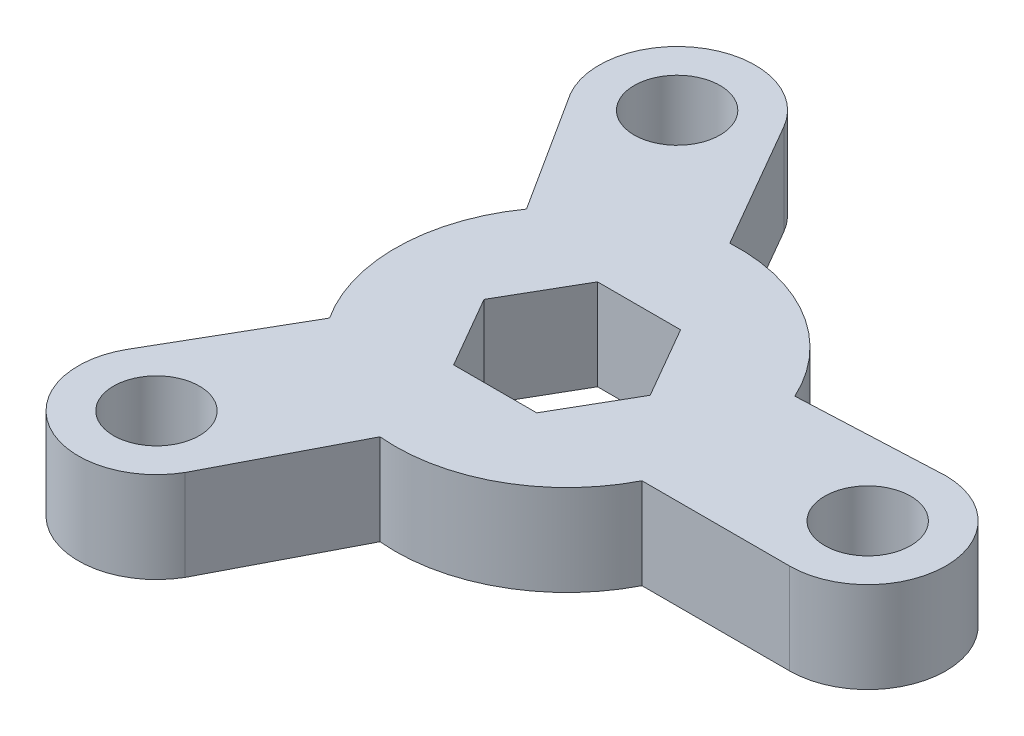
ISO-10303-21;
HEADER;
FILE_DESCRIPTION(('STEP AP214'),'2;1');
FILE_NAME('part.step','',(''),(''),'','','');
FILE_SCHEMA(('AUTOMOTIVE_DESIGN { 1 0 10303 214 1 1 1 1 }'));
ENDSEC;
DATA;
#1=APPLICATION_CONTEXT('core data for automotive mechanical design processes');
#2=APPLICATION_PROTOCOL_DEFINITION('international standard','automotive_design',2000,#1);
#3=PRODUCT_CONTEXT('',#1,'mechanical');
#4=PRODUCT('Part','Part','',(#3));
#5=PRODUCT_RELATED_PRODUCT_CATEGORY('part','',(#4));
#6=PRODUCT_DEFINITION_FORMATION('','',#4);
#7=PRODUCT_DEFINITION_CONTEXT('part definition',#1,'design');
#8=PRODUCT_DEFINITION('design','',#6,#7);
#9=PRODUCT_DEFINITION_SHAPE('','',#8);
#10=(LENGTH_UNIT() NAMED_UNIT(*) SI_UNIT(.MILLI.,.METRE.));
#11=(NAMED_UNIT(*) PLANE_ANGLE_UNIT() SI_UNIT($,.RADIAN.));
#12=(NAMED_UNIT(*) SI_UNIT($,.STERADIAN.) SOLID_ANGLE_UNIT());
#13=UNCERTAINTY_MEASURE_WITH_UNIT(LENGTH_MEASURE(1.E-05),#10,'distance_accuracy_value','');
#14=(GEOMETRIC_REPRESENTATION_CONTEXT(3) GLOBAL_UNCERTAINTY_ASSIGNED_CONTEXT((#13)) GLOBAL_UNIT_ASSIGNED_CONTEXT((#10,
#11,#12)) REPRESENTATION_CONTEXT('',''));
#15=CARTESIAN_POINT('',(0.,0.,0.));
#16=DIRECTION('',(0.,0.,1.));
#17=DIRECTION('',(1.,0.,0.));
#18=AXIS2_PLACEMENT_3D('',#15,#16,#17);
#19=CARTESIAN_POINT('',(-0.395779752572941,3.175,-0.228503546687791));
#20=DIRECTION('',(0.866025403784439,0.,0.5));
#21=DIRECTION('',(0.5,0.,-0.866025403784439));
#22=AXIS2_PLACEMENT_3D('',#19,#20,#21);
#23=PLANE('',#22);
#24=DIRECTION('',(-0.5,0.,0.866025403784439));
#25=VECTOR('',#24,1.);
#26=CARTESIAN_POINT('',(-0.395779752572941,0.,-0.228503546687791));
#27=LINE('',#26,#25);
#28=CARTESIAN_POINT('',(1.0641694903566,0.,-2.75720981191343));
#29=VERTEX_POINT('',#28);
#30=CARTESIAN_POINT('',(-0.386423060982366,0.,-0.24470981191342));
#31=VERTEX_POINT('',#30);
#32=EDGE_CURVE('E238',#29,#31,#27,.T.);
#33=ORIENTED_EDGE('',*,*,#32,.F.);
#34=DIRECTION('',(0.,-1.,0.));
#35=VECTOR('',#34,1.);
#36=CARTESIAN_POINT('',(1.0641694903566,3.175,-2.75720981191343));
#37=LINE('',#36,#35);
#38=CARTESIAN_POINT('',(1.0641694903566,3.175,-2.75720981191343));
#39=VERTEX_POINT('',#38);
#40=EDGE_CURVE('E11',#39,#29,#37,.T.);
#41=ORIENTED_EDGE('',*,*,#40,.F.);
#42=DIRECTION('',(-0.5,0.,0.866025403784439));
#43=VECTOR('',#42,1.);
#44=CARTESIAN_POINT('',(-0.395779752572941,3.175,-0.228503546687791));
#45=LINE('',#44,#43);
#46=CARTESIAN_POINT('',(-0.386423060982366,3.175,-0.24470981191342));
#47=VERTEX_POINT('',#46);
#48=EDGE_CURVE('E340',#39,#47,#45,.T.);
#49=ORIENTED_EDGE('',*,*,#48,.T.);
#50=DIRECTION('',(0.,-1.,0.));
#51=VECTOR('',#50,1.);
#52=CARTESIAN_POINT('',(-0.386423060982366,3.175,-0.24470981191342));
#53=LINE('',#52,#51);
#54=EDGE_CURVE('E54',#47,#31,#53,.T.);
#55=ORIENTED_EDGE('',*,*,#54,.T.);
#56=EDGE_LOOP('',(#33,#41,#49,#55));
#57=FACE_BOUND('',#56,.T.);
#58=ADVANCED_FACE('F35',(#57),#23,.T.);
#59=CARTESIAN_POINT('',(0.,3.175,-2.75720981191343));
#60=DIRECTION('',(0.,0.,1.));
#61=DIRECTION('',(1.,0.,0.));
#62=AXIS2_PLACEMENT_3D('',#59,#60,#61);
#63=PLANE('',#62);
#64=DIRECTION('',(-1.,0.,0.));
#65=VECTOR('',#64,1.);
#66=CARTESIAN_POINT('',(0.,0.,-2.75720981191343));
#67=LINE('',#66,#65);
#68=CARTESIAN_POINT('',(3.96535459303446,0.,-2.75720981191343));
#69=VERTEX_POINT('',#68);
#70=EDGE_CURVE('E240',#69,#29,#67,.T.);
#71=ORIENTED_EDGE('',*,*,#70,.F.);
#72=DIRECTION('',(0.,-1.,0.));
#73=VECTOR('',#72,1.);
#74=CARTESIAN_POINT('',(3.96535459303446,3.175,-2.75720981191343));
#75=LINE('',#74,#73);
#76=CARTESIAN_POINT('',(3.96535459303446,3.175,-2.75720981191343));
#77=VERTEX_POINT('',#76);
#78=EDGE_CURVE('E45',#77,#69,#75,.T.);
#79=ORIENTED_EDGE('',*,*,#78,.F.);
#80=DIRECTION('',(-1.,0.,0.));
#81=VECTOR('',#80,1.);
#82=CARTESIAN_POINT('',(0.,3.175,-2.75720981191343));
#83=LINE('',#82,#81);
#84=EDGE_CURVE('E342',#77,#39,#83,.T.);
#85=ORIENTED_EDGE('',*,*,#84,.T.);
#86=ORIENTED_EDGE('',*,*,#40,.T.);
#87=EDGE_LOOP('',(#71,#79,#85,#86));
#88=FACE_BOUND('',#87,.T.);
#89=ADVANCED_FACE('F367',(#88),#63,.T.);
#90=CARTESIAN_POINT('',(4.16792281511621,3.175,-2.40635135926893));
#91=DIRECTION('',(-0.866025403784439,0.,0.5));
#92=DIRECTION('',(0.5,0.,0.866025403784439));
#93=AXIS2_PLACEMENT_3D('',#90,#91,#92);
#94=PLANE('',#93);
#95=DIRECTION('',(-0.5,0.,-0.866025403784439));
#96=VECTOR('',#95,1.);
#97=CARTESIAN_POINT('',(4.16792281511621,0.,-2.40635135926893));
#98=LINE('',#97,#96);
#99=CARTESIAN_POINT('',(5.41594714437338,0.,-0.244709811913396));
#100=VERTEX_POINT('',#99);
#101=EDGE_CURVE('E243',#100,#69,#98,.T.);
#102=ORIENTED_EDGE('',*,*,#101,.F.);
#103=DIRECTION('',(0.,-1.,0.));
#104=VECTOR('',#103,1.);
#105=CARTESIAN_POINT('',(5.41594714437338,3.175,-0.244709811913396));
#106=LINE('',#105,#104);
#107=CARTESIAN_POINT('',(5.41594714437338,3.175,-0.244709811913396));
#108=VERTEX_POINT('',#107);
#109=EDGE_CURVE('E177',#108,#100,#106,.T.);
#110=ORIENTED_EDGE('',*,*,#109,.F.);
#111=DIRECTION('',(-0.5,0.,-0.866025403784439));
#112=VECTOR('',#111,1.);
#113=CARTESIAN_POINT('',(4.16792281511621,3.175,-2.40635135926893));
#114=LINE('',#113,#112);
#115=EDGE_CURVE('E189',#108,#77,#114,.T.);
#116=ORIENTED_EDGE('',*,*,#115,.T.);
#117=ORIENTED_EDGE('',*,*,#78,.T.);
#118=EDGE_LOOP('',(#102,#110,#116,#117));
#119=FACE_BOUND('',#118,.T.);
#120=ADVANCED_FACE('F346',(#119),#94,.T.);
#121=CARTESIAN_POINT('',(3.95599790144388,3.175,2.28399645331222));
#122=DIRECTION('',(-0.866025403784439,0.,-0.5));
#123=DIRECTION('',(-0.5,0.,0.866025403784439));
#124=AXIS2_PLACEMENT_3D('',#121,#122,#123);
#125=PLANE('',#124);
#126=DIRECTION('',(0.5,0.,-0.866025403784439));
#127=VECTOR('',#126,1.);
#128=CARTESIAN_POINT('',(3.95599790144388,0.,2.28399645331222));
#129=LINE('',#128,#127);
#130=CARTESIAN_POINT('',(3.96535459303446,0.,2.26779018808659));
#131=VERTEX_POINT('',#130);
#132=EDGE_CURVE('E173',#131,#100,#129,.T.);
#133=ORIENTED_EDGE('',*,*,#132,.F.);
#134=DIRECTION('',(0.,-1.,0.));
#135=VECTOR('',#134,1.);
#136=CARTESIAN_POINT('',(3.96535459303446,3.175,2.26779018808659));
#137=LINE('',#136,#135);
#138=CARTESIAN_POINT('',(3.96535459303446,3.175,2.26779018808659));
#139=VERTEX_POINT('',#138);
#140=EDGE_CURVE('E168',#139,#131,#137,.T.);
#141=ORIENTED_EDGE('',*,*,#140,.F.);
#142=DIRECTION('',(0.5,0.,-0.866025403784439));
#143=VECTOR('',#142,1.);
#144=CARTESIAN_POINT('',(3.95599790144388,3.175,2.28399645331222));
#145=LINE('',#144,#143);
#146=EDGE_CURVE('E171',#139,#108,#145,.T.);
#147=ORIENTED_EDGE('',*,*,#146,.T.);
#148=ORIENTED_EDGE('',*,*,#109,.T.);
#149=EDGE_LOOP('',(#133,#141,#147,#148));
#150=FACE_BOUND('',#149,.T.);
#151=ADVANCED_FACE('F170',(#150),#125,.T.);
#152=CARTESIAN_POINT('',(0.,3.175,2.26779018808659));
#153=DIRECTION('',(0.,0.,-1.));
#154=DIRECTION('',(-1.,0.,0.));
#155=AXIS2_PLACEMENT_3D('',#152,#153,#154);
#156=PLANE('',#155);
#157=DIRECTION('',(1.,0.,0.));
#158=VECTOR('',#157,1.);
#159=CARTESIAN_POINT('',(0.,0.,2.26779018808659));
#160=LINE('',#159,#158);
#161=CARTESIAN_POINT('',(1.06416949035655,0.,2.26779018808659));
#162=VERTEX_POINT('',#161);
#163=EDGE_CURVE('E247',#162,#131,#160,.T.);
#164=ORIENTED_EDGE('',*,*,#163,.F.);
#165=DIRECTION('',(0.,-1.,0.));
#166=VECTOR('',#165,1.);
#167=CARTESIAN_POINT('',(1.06416949035655,3.175,2.26779018808659));
#168=LINE('',#167,#166);
#169=CARTESIAN_POINT('',(1.06416949035655,3.175,2.26779018808659));
#170=VERTEX_POINT('',#169);
#171=EDGE_CURVE('E109',#170,#162,#168,.T.);
#172=ORIENTED_EDGE('',*,*,#171,.F.);
#173=DIRECTION('',(1.,0.,0.));
#174=VECTOR('',#173,1.);
#175=CARTESIAN_POINT('',(0.,3.175,2.26779018808659));
#176=LINE('',#175,#174);
#177=EDGE_CURVE('E186',#170,#139,#176,.T.);
#178=ORIENTED_EDGE('',*,*,#177,.T.);
#179=ORIENTED_EDGE('',*,*,#140,.T.);
#180=EDGE_LOOP('',(#164,#172,#178,#179));
#181=FACE_BOUND('',#180,.T.);
#182=ADVANCED_FACE('F191',(#181),#156,.T.);
#183=CARTESIAN_POINT('',(0.000141202007934749,3.175,-9.02915575815009E-05));
#184=DIRECTION('',(0.842481897664744,0.,-0.538724653331562));
#185=DIRECTION('',(-0.538724653331562,0.,-0.842481897664744));
#186=AXIS2_PLACEMENT_3D('',#183,#184,#185);
#187=PLANE('',#186);
#188=DIRECTION('',(0.538724653331562,0.,0.842481897664744));
#189=VECTOR('',#188,1.);
#190=CARTESIAN_POINT('',(0.000141202007934749,0.,-9.02915575815009E-05));
#191=LINE('',#190,#189);
#192=CARTESIAN_POINT('',(-5.09848661235615,0.,-7.973554305071));
#193=VERTEX_POINT('',#192);
#194=CARTESIAN_POINT('',(-2.37747949642457,0.,-3.71832071883577));
#195=VERTEX_POINT('',#194);
#196=EDGE_CURVE('E204',#193,#195,#191,.T.);
#197=ORIENTED_EDGE('',*,*,#196,.T.);
#198=DIRECTION('',(0.,-1.,0.));
#199=VECTOR('',#198,1.);
#200=CARTESIAN_POINT('',(-2.37747949642457,3.175,-3.71832071883577));
#201=LINE('',#200,#199);
#202=CARTESIAN_POINT('',(-2.37747949642457,3.175,-3.71832071883577));
#203=VERTEX_POINT('',#202);
#204=EDGE_CURVE('E39',#203,#195,#201,.T.);
#205=ORIENTED_EDGE('',*,*,#204,.F.);
#206=DIRECTION('',(0.538724653331562,0.,0.842481897664744));
#207=VECTOR('',#206,1.);
#208=CARTESIAN_POINT('',(0.000141202007934749,3.175,-9.02915575815009E-05));
#209=LINE('',#208,#207);
#210=CARTESIAN_POINT('',(-5.09848661235615,3.175,-7.973554305071));
#211=VERTEX_POINT('',#210);
#212=EDGE_CURVE('E258',#211,#203,#209,.T.);
#213=ORIENTED_EDGE('',*,*,#212,.F.);
#214=DIRECTION('',(0.,-1.,0.));
#215=VECTOR('',#214,1.);
#216=CARTESIAN_POINT('',(-5.09848661235615,3.175,-7.973554305071));
#217=LINE('',#216,#215);
#218=EDGE_CURVE('E203',#211,#193,#217,.T.);
#219=ORIENTED_EDGE('',*,*,#218,.T.);
#220=EDGE_LOOP('',(#197,#205,#213,#219));
#221=FACE_BOUND('',#220,.T.);
#222=ADVANCED_FACE('F37',(#221),#187,.F.);
#223=CARTESIAN_POINT('',(2.51476204169552,3.175,-0.24470981191342));
#224=DIRECTION('',(0.,-1.,0.));
#225=DIRECTION('',(0.,0.,-1.));
#226=AXIS2_PLACEMENT_3D('',#223,#224,#225);
#227=CYLINDRICAL_SURFACE('',#226,6.00000000000002);
#228=CARTESIAN_POINT('',(2.51476204169552,0.,-0.24470981191342));
#229=DIRECTION('',(0.,1.,0.));
#230=DIRECTION('',(0.,0.,1.));
#231=AXIS2_PLACEMENT_3D('',#228,#229,#230);
#232=CIRCLE('',#231,6.00000000000002);
#233=CARTESIAN_POINT('',(-2.52025605095693,0.,3.01850835527385));
#234=VERTEX_POINT('',#233);
#235=EDGE_CURVE('E207',#195,#234,#232,.T.);
#236=ORIENTED_EDGE('',*,*,#235,.T.);
#237=DIRECTION('',(0.,-1.,0.));
#238=VECTOR('',#237,1.);
#239=CARTESIAN_POINT('',(-2.52025605095693,3.175,3.01850835527385));
#240=LINE('',#239,#238);
#241=CARTESIAN_POINT('',(-2.52025605095693,3.175,3.01850835527385));
#242=VERTEX_POINT('',#241);
#243=EDGE_CURVE('E286',#242,#234,#240,.T.);
#244=ORIENTED_EDGE('',*,*,#243,.F.);
#245=CARTESIAN_POINT('',(2.51476204169552,3.175,-0.24470981191342));
#246=DIRECTION('',(0.,1.,0.));
#247=DIRECTION('',(0.,0.,1.));
#248=AXIS2_PLACEMENT_3D('',#245,#246,#247);
#249=CIRCLE('',#248,6.00000000000002);
#250=EDGE_CURVE('E122',#203,#242,#249,.T.);
#251=ORIENTED_EDGE('',*,*,#250,.F.);
#252=ORIENTED_EDGE('',*,*,#204,.T.);
#253=EDGE_LOOP('',(#236,#244,#251,#252));
#254=FACE_BOUND('',#253,.T.);
#255=ADVANCED_FACE('F291',(#254),#227,.T.);
#256=CARTESIAN_POINT('',(-0.583139579616312,3.175,-0.336675793266596));
#257=DIRECTION('',(-0.866025403784443,0.,-0.499999999999992));
#258=DIRECTION('',(-0.499999999999992,0.,0.866025403784443));
#259=AXIS2_PLACEMENT_3D('',#256,#257,#258);
#260=PLANE('',#259);
#261=DIRECTION('',(0.499999999999992,0.,-0.866025403784443));
#262=VECTOR('',#261,1.);
#263=CARTESIAN_POINT('',(-0.583139579616312,0.,-0.336675793266596));
#264=LINE('',#263,#262);
#265=CARTESIAN_POINT('',(-5.09848661235621,0.,7.48413468124445));
#266=VERTEX_POINT('',#265);
#267=EDGE_CURVE('E210',#266,#234,#264,.T.);
#268=ORIENTED_EDGE('',*,*,#267,.F.);
#269=DIRECTION('',(0.,-1.,0.));
#270=VECTOR('',#269,1.);
#271=CARTESIAN_POINT('',(-5.09848661235621,3.175,7.48413468124445));
#272=LINE('',#271,#270);
#273=CARTESIAN_POINT('',(-5.09848661235621,3.175,7.48413468124445));
#274=VERTEX_POINT('',#273);
#275=EDGE_CURVE('E285',#274,#266,#272,.T.);
#276=ORIENTED_EDGE('',*,*,#275,.F.);
#277=DIRECTION('',(0.499999999999992,0.,-0.866025403784443));
#278=VECTOR('',#277,1.);
#279=CARTESIAN_POINT('',(-0.583139579616312,3.175,-0.336675793266596));
#280=LINE('',#279,#278);
#281=EDGE_CURVE('E306',#274,#242,#280,.T.);
#282=ORIENTED_EDGE('',*,*,#281,.T.);
#283=ORIENTED_EDGE('',*,*,#243,.T.);
#284=EDGE_LOOP('',(#268,#276,#282,#283));
#285=FACE_BOUND('',#284,.T.);
#286=ADVANCED_FACE('F303',(#285),#260,.T.);
#287=CARTESIAN_POINT('',(-2.73523795830433,3.175,8.84855692782332));
#288=DIRECTION('',(0.,-1.,0.));
#289=DIRECTION('',(0.,0.,-1.));
#290=AXIS2_PLACEMENT_3D('',#287,#288,#289);
#291=CYLINDRICAL_SURFACE('',#290,2.72884449315768);
#292=CARTESIAN_POINT('',(-2.73523795830433,0.,8.84855692782332));
#293=DIRECTION('',(0.,1.,0.));
#294=DIRECTION('',(0.,0.,1.));
#295=AXIS2_PLACEMENT_3D('',#292,#293,#294);
#296=CIRCLE('',#295,2.72884449315768);
#297=CARTESIAN_POINT('',(-0.371989304252619,0.,10.2129791744022));
#298=VERTEX_POINT('',#297);
#299=EDGE_CURVE('E213',#266,#298,#296,.T.);
#300=ORIENTED_EDGE('',*,*,#299,.T.);
#301=DIRECTION('',(0.,-1.,0.));
#302=VECTOR('',#301,1.);
#303=CARTESIAN_POINT('',(-0.371989304252619,3.175,10.2129791744022));
#304=LINE('',#303,#302);
#305=CARTESIAN_POINT('',(-0.371989304252619,3.175,10.2129791744022));
#306=VERTEX_POINT('',#305);
#307=EDGE_CURVE('E282',#306,#298,#304,.T.);
#308=ORIENTED_EDGE('',*,*,#307,.F.);
#309=CARTESIAN_POINT('',(-2.73523795830433,3.175,8.84855692782332));
#310=DIRECTION('',(0.,1.,0.));
#311=DIRECTION('',(0.,0.,1.));
#312=AXIS2_PLACEMENT_3D('',#309,#310,#311);
#313=CIRCLE('',#312,2.72884449315768);
#314=EDGE_CURVE('E309',#274,#306,#313,.T.);
#315=ORIENTED_EDGE('',*,*,#314,.F.);
#316=ORIENTED_EDGE('',*,*,#275,.T.);
#317=EDGE_LOOP('',(#300,#308,#315,#316));
#318=FACE_BOUND('',#317,.T.);
#319=ADVANCED_FACE('F310',(#318),#291,.T.);
#320=CARTESIAN_POINT('',(3.87987291900624,3.175,2.01140464348378));
#321=DIRECTION('',(-0.887790184262472,0.,-0.460248398940405));
#322=DIRECTION('',(-0.460248398940405,0.,0.887790184262472));
#323=AXIS2_PLACEMENT_3D('',#320,#321,#322);
#324=PLANE('',#323);
#325=DIRECTION('',(0.460248398940405,0.,-0.887790184262472));
#326=VECTOR('',#325,1.);
#327=CARTESIAN_POINT('',(3.87987291900624,0.,2.01140464348378));
#328=LINE('',#327,#326);
#329=CARTESIAN_POINT('',(1.95264752249807,0.,5.72890109500941));
#330=VERTEX_POINT('',#329);
#331=EDGE_CURVE('E215',#298,#330,#328,.T.);
#332=ORIENTED_EDGE('',*,*,#331,.T.);
#333=DIRECTION('',(0.,-1.,0.));
#334=VECTOR('',#333,1.);
#335=CARTESIAN_POINT('',(1.95264752249807,3.175,5.72890109500941));
#336=LINE('',#335,#334);
#337=CARTESIAN_POINT('',(1.95264752249807,3.175,5.72890109500941));
#338=VERTEX_POINT('',#337);
#339=EDGE_CURVE('E279',#338,#330,#336,.T.);
#340=ORIENTED_EDGE('',*,*,#339,.F.);
#341=DIRECTION('',(0.460248398940405,0.,-0.887790184262472));
#342=VECTOR('',#341,1.);
#343=CARTESIAN_POINT('',(3.87987291900624,3.175,2.01140464348378));
#344=LINE('',#343,#342);
#345=EDGE_CURVE('E313',#306,#338,#344,.T.);
#346=ORIENTED_EDGE('',*,*,#345,.F.);
#347=ORIENTED_EDGE('',*,*,#307,.T.);
#348=EDGE_LOOP('',(#332,#340,#346,#347));
#349=FACE_BOUND('',#348,.T.);
#350=ADVANCED_FACE('F402',(#349),#324,.F.);
#351=CARTESIAN_POINT('',(2.51476204169552,3.175,-0.24470981191342));
#352=DIRECTION('',(0.,-1.,0.));
#353=DIRECTION('',(0.,0.,-1.));
#354=AXIS2_PLACEMENT_3D('',#351,#352,#353);
#355=CYLINDRICAL_SURFACE('',#354,6.00000000000002);
#356=CARTESIAN_POINT('',(2.51476204169552,0.,-0.24470981191342));
#357=DIRECTION('',(0.,1.,0.));
#358=DIRECTION('',(0.,0.,1.));
#359=AXIS2_PLACEMENT_3D('',#356,#357,#358);
#360=CIRCLE('',#359,6.00000000000002);
#361=CARTESIAN_POINT('',(7.85830091889671,0.,2.48413468124468));
#362=VERTEX_POINT('',#361);
#363=EDGE_CURVE('E217',#330,#362,#360,.T.);
#364=ORIENTED_EDGE('',*,*,#363,.T.);
#365=DIRECTION('',(0.,-1.,0.));
#366=VECTOR('',#365,1.);
#367=CARTESIAN_POINT('',(7.85830091889671,3.175,2.48413468124468));
#368=LINE('',#367,#366);
#369=CARTESIAN_POINT('',(7.85830091889671,3.175,2.48413468124468));
#370=VERTEX_POINT('',#369);
#371=EDGE_CURVE('E277',#370,#362,#368,.T.);
#372=ORIENTED_EDGE('',*,*,#371,.F.);
#373=CARTESIAN_POINT('',(2.51476204169552,3.175,-0.24470981191342));
#374=DIRECTION('',(0.,1.,0.));
#375=DIRECTION('',(0.,0.,1.));
#376=AXIS2_PLACEMENT_3D('',#373,#374,#375);
#377=CIRCLE('',#376,6.00000000000002);
#378=EDGE_CURVE('E321',#338,#370,#377,.T.);
#379=ORIENTED_EDGE('',*,*,#378,.F.);
#380=ORIENTED_EDGE('',*,*,#339,.T.);
#381=EDGE_LOOP('',(#364,#372,#379,#380));
#382=FACE_BOUND('',#381,.T.);
#383=ADVANCED_FACE('F398',(#382),#355,.T.);
#384=CARTESIAN_POINT('',(0.,3.175,2.48413468124466));
#385=DIRECTION('',(0.,0.,1.));
#386=DIRECTION('',(1.,0.,0.));
#387=AXIS2_PLACEMENT_3D('',#384,#385,#386);
#388=PLANE('',#387);
#389=DIRECTION('',(-1.,0.,0.));
#390=VECTOR('',#389,1.);
#391=CARTESIAN_POINT('',(0.,0.,2.48413468124466));
#392=LINE('',#391,#390);
#393=CARTESIAN_POINT('',(13.0147620416956,0.,2.48413468124467));
#394=VERTEX_POINT('',#393);
#395=EDGE_CURVE('E220',#394,#362,#392,.T.);
#396=ORIENTED_EDGE('',*,*,#395,.F.);
#397=DIRECTION('',(0.,-1.,0.));
#398=VECTOR('',#397,1.);
#399=CARTESIAN_POINT('',(13.0147620416956,3.175,2.48413468124467));
#400=LINE('',#399,#398);
#401=CARTESIAN_POINT('',(13.0147620416956,3.175,2.48413468124467));
#402=VERTEX_POINT('',#401);
#403=EDGE_CURVE('E275',#402,#394,#400,.T.);
#404=ORIENTED_EDGE('',*,*,#403,.F.);
#405=DIRECTION('',(-1.,0.,0.));
#406=VECTOR('',#405,1.);
#407=CARTESIAN_POINT('',(0.,3.175,2.48413468124466));
#408=LINE('',#407,#406);
#409=EDGE_CURVE('E323',#402,#370,#408,.T.);
#410=ORIENTED_EDGE('',*,*,#409,.T.);
#411=ORIENTED_EDGE('',*,*,#371,.T.);
#412=EDGE_LOOP('',(#396,#404,#410,#411));
#413=FACE_BOUND('',#412,.T.);
#414=ADVANCED_FACE('F394',(#413),#388,.T.);
#415=CARTESIAN_POINT('',(13.0147620416956,3.175,-0.244709811913082));
#416=DIRECTION('',(0.,-1.,0.));
#417=DIRECTION('',(0.,0.,-1.));
#418=AXIS2_PLACEMENT_3D('',#415,#416,#417);
#419=CYLINDRICAL_SURFACE('',#418,2.72884449315774);
#420=CARTESIAN_POINT('',(13.0147620416956,0.,-0.244709811913082));
#421=DIRECTION('',(0.,1.,0.));
#422=DIRECTION('',(0.,0.,1.));
#423=AXIS2_PLACEMENT_3D('',#420,#421,#422);
#424=CIRCLE('',#423,2.72884449315774);
#425=CARTESIAN_POINT('',(13.0147620416957,0.,-2.97355430507082));
#426=VERTEX_POINT('',#425);
#427=EDGE_CURVE('E223',#394,#426,#424,.T.);
#428=ORIENTED_EDGE('',*,*,#427,.T.);
#429=DIRECTION('',(0.,-1.,0.));
#430=VECTOR('',#429,1.);
#431=CARTESIAN_POINT('',(13.0147620416957,3.175,-2.97355430507082));
#432=LINE('',#431,#430);
#433=CARTESIAN_POINT('',(13.0147620416957,3.175,-2.97355430507082));
#434=VERTEX_POINT('',#433);
#435=EDGE_CURVE('E272',#434,#426,#432,.T.);
#436=ORIENTED_EDGE('',*,*,#435,.F.);
#437=CARTESIAN_POINT('',(13.0147620416956,3.175,-0.244709811913082));
#438=DIRECTION('',(0.,1.,0.));
#439=DIRECTION('',(0.,0.,1.));
#440=AXIS2_PLACEMENT_3D('',#437,#438,#439);
#441=CIRCLE('',#440,2.72884449315774);
#442=EDGE_CURVE('E326',#402,#434,#441,.T.);
#443=ORIENTED_EDGE('',*,*,#442,.F.);
#444=ORIENTED_EDGE('',*,*,#403,.T.);
#445=EDGE_LOOP('',(#428,#436,#443,#444));
#446=FACE_BOUND('',#445,.T.);
#447=ADVANCED_FACE('F390',(#446),#419,.T.);
#448=CARTESIAN_POINT('',(-0.107871058470726,3.175,-2.37837906979635));
#449=DIRECTION('',(0.0453082865977022,0.,0.998973052271972));
#450=DIRECTION('',(0.998973052271972,0.,-0.0453082865977022));
#451=AXIS2_PLACEMENT_3D('',#448,#449,#450);
#452=PLANE('',#451);
#453=DIRECTION('',(-0.998973052271972,0.,0.0453082865977022));
#454=VECTOR('',#453,1.);
#455=CARTESIAN_POINT('',(-0.107871058470726,0.,-2.37837906979635));
#456=LINE('',#455,#454);
#457=CARTESIAN_POINT('',(7.96911809901329,0.,-2.74470981191351));
#458=VERTEX_POINT('',#457);
#459=EDGE_CURVE('E225',#426,#458,#456,.T.);
#460=ORIENTED_EDGE('',*,*,#459,.T.);
#461=DIRECTION('',(0.,-1.,0.));
#462=VECTOR('',#461,1.);
#463=CARTESIAN_POINT('',(7.96911809901329,3.175,-2.74470981191351));
#464=LINE('',#463,#462);
#465=CARTESIAN_POINT('',(7.96911809901329,3.175,-2.74470981191351));
#466=VERTEX_POINT('',#465);
#467=EDGE_CURVE('E269',#466,#458,#464,.T.);
#468=ORIENTED_EDGE('',*,*,#467,.F.);
#469=DIRECTION('',(-0.998973052271972,0.,0.0453082865977022));
#470=VECTOR('',#469,1.);
#471=CARTESIAN_POINT('',(-0.107871058470726,3.175,-2.37837906979635));
#472=LINE('',#471,#470);
#473=EDGE_CURVE('E328',#434,#466,#472,.T.);
#474=ORIENTED_EDGE('',*,*,#473,.F.);
#475=ORIENTED_EDGE('',*,*,#435,.T.);
#476=EDGE_LOOP('',(#460,#468,#474,#475));
#477=FACE_BOUND('',#476,.T.);
#478=ADVANCED_FACE('F386',(#477),#452,.F.);
#479=CARTESIAN_POINT('',(2.51476204169552,3.175,-0.24470981191342));
#480=DIRECTION('',(0.,-1.,0.));
#481=DIRECTION('',(0.,0.,-1.));
#482=AXIS2_PLACEMENT_3D('',#479,#480,#481);
#483=CYLINDRICAL_SURFACE('',#482,6.00000000000002);
#484=CARTESIAN_POINT('',(2.51476204169552,0.,-0.24470981191342));
#485=DIRECTION('',(0.,1.,0.));
#486=DIRECTION('',(0.,0.,1.));
#487=AXIS2_PLACEMENT_3D('',#484,#485,#486);
#488=CIRCLE('',#487,6.00000000000002);
#489=CARTESIAN_POINT('',(2.20624125714704,0.,-6.23677247225827));
#490=VERTEX_POINT('',#489);
#491=EDGE_CURVE('E227',#458,#490,#488,.T.);
#492=ORIENTED_EDGE('',*,*,#491,.T.);
#493=DIRECTION('',(0.,-1.,0.));
#494=VECTOR('',#493,1.);
#495=CARTESIAN_POINT('',(2.20624125714704,3.175,-6.23677247225827));
#496=LINE('',#495,#494);
#497=CARTESIAN_POINT('',(2.20624125714704,3.175,-6.23677247225827));
#498=VERTEX_POINT('',#497);
#499=EDGE_CURVE('E267',#498,#490,#496,.T.);
#500=ORIENTED_EDGE('',*,*,#499,.F.);
#501=CARTESIAN_POINT('',(2.51476204169552,3.175,-0.24470981191342));
#502=DIRECTION('',(0.,1.,0.));
#503=DIRECTION('',(0.,0.,1.));
#504=AXIS2_PLACEMENT_3D('',#501,#502,#503);
#505=CIRCLE('',#504,6.00000000000002);
#506=EDGE_CURVE('E330',#466,#498,#505,.T.);
#507=ORIENTED_EDGE('',*,*,#506,.F.);
#508=ORIENTED_EDGE('',*,*,#467,.T.);
#509=EDGE_LOOP('',(#492,#500,#507,#508));
#510=FACE_BOUND('',#509,.T.);
#511=ADVANCED_FACE('F382',(#510),#483,.T.);
#512=CARTESIAN_POINT('',(4.35528264215976,3.175,-2.51452360584784));
#513=DIRECTION('',(0.866025403784439,0.,-0.5));
#514=DIRECTION('',(-0.5,0.,-0.866025403784439));
#515=AXIS2_PLACEMENT_3D('',#512,#513,#514);
#516=PLANE('',#515);
#517=DIRECTION('',(0.5,0.,0.866025403784439));
#518=VECTOR('',#517,1.);
#519=CARTESIAN_POINT('',(4.35528264215976,0.,-2.51452360584784));
#520=LINE('',#519,#518);
#521=CARTESIAN_POINT('',(-0.371989304252358,0.,-10.7023987982286));
#522=VERTEX_POINT('',#521);
#523=EDGE_CURVE('E230',#522,#490,#520,.T.);
#524=ORIENTED_EDGE('',*,*,#523,.F.);
#525=DIRECTION('',(0.,-1.,0.));
#526=VECTOR('',#525,1.);
#527=CARTESIAN_POINT('',(-0.371989304252358,3.175,-10.7023987982286));
#528=LINE('',#527,#526);
#529=CARTESIAN_POINT('',(-0.371989304252358,3.175,-10.7023987982286));
#530=VERTEX_POINT('',#529);
#531=EDGE_CURVE('E265',#530,#522,#528,.T.);
#532=ORIENTED_EDGE('',*,*,#531,.F.);
#533=DIRECTION('',(0.5,0.,0.866025403784439));
#534=VECTOR('',#533,1.);
#535=CARTESIAN_POINT('',(4.35528264215976,3.175,-2.51452360584784));
#536=LINE('',#535,#534);
#537=EDGE_CURVE('E332',#530,#498,#536,.T.);
#538=ORIENTED_EDGE('',*,*,#537,.T.);
#539=ORIENTED_EDGE('',*,*,#499,.T.);
#540=EDGE_LOOP('',(#524,#532,#538,#539));
#541=FACE_BOUND('',#540,.T.);
#542=ADVANCED_FACE('F362',(#541),#516,.T.);
#543=CARTESIAN_POINT('',(-2.73523795830456,3.175,8.84855692782314));
#544=DIRECTION('',(0.,-1.,0.));
#545=DIRECTION('',(0.,0.,-1.));
#546=AXIS2_PLACEMENT_3D('',#543,#544,#545);
#547=CYLINDRICAL_SURFACE('',#546,1.50000000000004);
#548=CARTESIAN_POINT('',(-2.73523795830456,3.175,8.84855692782314));
#549=DIRECTION('',(0.,1.,0.));
#550=DIRECTION('',(0.,0.,1.));
#551=AXIS2_PLACEMENT_3D('',#548,#549,#550);
#552=CIRCLE('',#551,1.50000000000004);
#553=CARTESIAN_POINT('',(-2.73523795830456,3.175,10.3485569278232));
#554=VERTEX_POINT('',#553);
#555=EDGE_CURVE('E194',#554,#554,#552,.T.);
#556=ORIENTED_EDGE('',*,*,#555,.T.);
#557=EDGE_LOOP('',(#556));
#558=FACE_BOUND('',#557,.T.);
#559=CARTESIAN_POINT('',(-2.73523795830456,0.,8.84855692782314));
#560=DIRECTION('',(0.,1.,0.));
#561=DIRECTION('',(0.,0.,1.));
#562=AXIS2_PLACEMENT_3D('',#559,#560,#561);
#563=CIRCLE('',#562,1.50000000000004);
#564=CARTESIAN_POINT('',(-2.73523795830456,0.,10.3485569278232));
#565=VERTEX_POINT('',#564);
#566=EDGE_CURVE('E252',#565,#565,#563,.T.);
#567=ORIENTED_EDGE('',*,*,#566,.F.);
#568=EDGE_LOOP('',(#567));
#569=FACE_BOUND('',#568,.T.);
#570=ADVANCED_FACE('F353',(#558,#569),#547,.F.);
#571=CARTESIAN_POINT('',(-0.183854838900608,3.175,0.106148640731081));
#572=DIRECTION('',(0.866025403784439,0.,-0.5));
#573=DIRECTION('',(-0.5,0.,-0.866025403784439));
#574=AXIS2_PLACEMENT_3D('',#571,#572,#573);
#575=PLANE('',#574);
#576=DIRECTION('',(0.5,0.,0.866025403784439));
#577=VECTOR('',#576,1.);
#578=CARTESIAN_POINT('',(-0.183854838900608,0.,0.106148640731081));
#579=LINE('',#578,#577);
#580=EDGE_CURVE('E249',#31,#162,#579,.T.);
#581=ORIENTED_EDGE('',*,*,#580,.F.);
#582=ORIENTED_EDGE('',*,*,#54,.F.);
#583=DIRECTION('',(0.5,0.,0.866025403784439));
#584=VECTOR('',#583,1.);
#585=CARTESIAN_POINT('',(-0.183854838900608,3.175,0.106148640731081));
#586=LINE('',#585,#584);
#587=EDGE_CURVE('E192',#47,#170,#586,.T.);
#588=ORIENTED_EDGE('',*,*,#587,.T.);
#589=ORIENTED_EDGE('',*,*,#171,.T.);
#590=EDGE_LOOP('',(#581,#582,#588,#589));
#591=FACE_BOUND('',#590,.T.);
#592=ADVANCED_FACE('F350',(#591),#575,.T.);
#593=CARTESIAN_POINT('',(13.0147620416955,3.175,-0.244709811913334));
#594=DIRECTION('',(0.,-1.,0.));
#595=DIRECTION('',(0.,0.,-1.));
#596=AXIS2_PLACEMENT_3D('',#593,#594,#595);
#597=CYLINDRICAL_SURFACE('',#596,1.50000000000004);
#598=CARTESIAN_POINT('',(13.0147620416955,3.175,-0.244709811913334));
#599=DIRECTION('',(0.,1.,0.));
#600=DIRECTION('',(0.,0.,1.));
#601=AXIS2_PLACEMENT_3D('',#598,#599,#600);
#602=CIRCLE('',#601,1.50000000000004);
#603=CARTESIAN_POINT('',(13.0147620416955,3.175,1.2552901880867));
#604=VERTEX_POINT('',#603);
#605=EDGE_CURVE('E337',#604,#604,#602,.T.);
#606=ORIENTED_EDGE('',*,*,#605,.T.);
#607=EDGE_LOOP('',(#606));
#608=FACE_BOUND('',#607,.T.);
#609=CARTESIAN_POINT('',(13.0147620416955,0.,-0.244709811913334));
#610=DIRECTION('',(0.,1.,0.));
#611=DIRECTION('',(0.,0.,1.));
#612=AXIS2_PLACEMENT_3D('',#609,#610,#611);
#613=CIRCLE('',#612,1.50000000000004);
#614=CARTESIAN_POINT('',(13.0147620416955,0.,1.2552901880867));
#615=VERTEX_POINT('',#614);
#616=EDGE_CURVE('E235',#615,#615,#613,.T.);
#617=ORIENTED_EDGE('',*,*,#616,.F.);
#618=EDGE_LOOP('',(#617));
#619=FACE_BOUND('',#618,.T.);
#620=ADVANCED_FACE('F352',(#608,#619),#597,.F.);
#621=CARTESIAN_POINT('',(-2.73523795830425,3.175,-9.33797655164976));
#622=DIRECTION('',(0.,-1.,0.));
#623=DIRECTION('',(0.,0.,-1.));
#624=AXIS2_PLACEMENT_3D('',#621,#622,#623);
#625=CYLINDRICAL_SURFACE('',#624,2.72884449315774);
#626=CARTESIAN_POINT('',(-2.73523795830425,0.,-9.33797655164976));
#627=DIRECTION('',(0.,1.,0.));
#628=DIRECTION('',(0.,0.,1.));
#629=AXIS2_PLACEMENT_3D('',#626,#627,#628);
#630=CIRCLE('',#629,2.72884449315774);
#631=EDGE_CURVE('E233',#522,#193,#630,.T.);
#632=ORIENTED_EDGE('',*,*,#631,.T.);
#633=ORIENTED_EDGE('',*,*,#218,.F.);
#634=CARTESIAN_POINT('',(-2.73523795830425,3.175,-9.33797655164976));
#635=DIRECTION('',(0.,1.,0.));
#636=DIRECTION('',(0.,0.,1.));
#637=AXIS2_PLACEMENT_3D('',#634,#635,#636);
#638=CIRCLE('',#637,2.72884449315774);
#639=EDGE_CURVE('E335',#530,#211,#638,.T.);
#640=ORIENTED_EDGE('',*,*,#639,.F.);
#641=ORIENTED_EDGE('',*,*,#531,.T.);
#642=EDGE_LOOP('',(#632,#633,#640,#641));
#643=FACE_BOUND('',#642,.T.);
#644=ADVANCED_FACE('F359',(#643),#625,.T.);
#645=CARTESIAN_POINT('',(-2.73523795830425,3.175,-9.33797655164976));
#646=DIRECTION('',(0.,-1.,0.));
#647=DIRECTION('',(0.,0.,-1.));
#648=AXIS2_PLACEMENT_3D('',#645,#646,#647);
#649=CYLINDRICAL_SURFACE('',#648,1.49999999999987);
#650=CARTESIAN_POINT('',(-2.73523795830425,3.175,-9.33797655164976));
#651=DIRECTION('',(0.,1.,0.));
#652=DIRECTION('',(0.,0.,1.));
#653=AXIS2_PLACEMENT_3D('',#650,#651,#652);
#654=CIRCLE('',#653,1.49999999999987);
#655=CARTESIAN_POINT('',(-2.73523795830425,3.175,-7.83797655164989));
#656=VERTEX_POINT('',#655);
#657=EDGE_CURVE('E200',#656,#656,#654,.T.);
#658=ORIENTED_EDGE('',*,*,#657,.T.);
#659=EDGE_LOOP('',(#658));
#660=FACE_BOUND('',#659,.T.);
#661=CARTESIAN_POINT('',(-2.73523795830425,0.,-9.33797655164976));
#662=DIRECTION('',(0.,1.,0.));
#663=DIRECTION('',(0.,0.,1.));
#664=AXIS2_PLACEMENT_3D('',#661,#662,#663);
#665=CIRCLE('',#664,1.49999999999987);
#666=CARTESIAN_POINT('',(-2.73523795830425,0.,-7.83797655164989));
#667=VERTEX_POINT('',#666);
#668=EDGE_CURVE('E255',#667,#667,#665,.T.);
#669=ORIENTED_EDGE('',*,*,#668,.F.);
#670=EDGE_LOOP('',(#669));
#671=FACE_BOUND('',#670,.T.);
#672=ADVANCED_FACE('F378',(#660,#671),#649,.F.);
#673=CARTESIAN_POINT('',(0.,3.175,0.));
#674=DIRECTION('',(0.,1.,0.));
#675=DIRECTION('',(0.,0.,1.));
#676=AXIS2_PLACEMENT_3D('',#673,#674,#675);
#677=PLANE('',#676);
#678=ORIENTED_EDGE('',*,*,#212,.T.);
#679=ORIENTED_EDGE('',*,*,#250,.T.);
#680=ORIENTED_EDGE('',*,*,#281,.F.);
#681=ORIENTED_EDGE('',*,*,#314,.T.);
#682=ORIENTED_EDGE('',*,*,#345,.T.);
#683=ORIENTED_EDGE('',*,*,#378,.T.);
#684=ORIENTED_EDGE('',*,*,#409,.F.);
#685=ORIENTED_EDGE('',*,*,#442,.T.);
#686=ORIENTED_EDGE('',*,*,#473,.T.);
#687=ORIENTED_EDGE('',*,*,#506,.T.);
#688=ORIENTED_EDGE('',*,*,#537,.F.);
#689=ORIENTED_EDGE('',*,*,#639,.T.);
#690=EDGE_LOOP('',(#678,#679,#680,#681,#682,#683,#684,#685,#686,#687,#688,#689));
#691=FACE_BOUND('',#690,.T.);
#692=ORIENTED_EDGE('',*,*,#605,.F.);
#693=EDGE_LOOP('',(#692));
#694=FACE_BOUND('',#693,.T.);
#695=ORIENTED_EDGE('',*,*,#48,.F.);
#696=ORIENTED_EDGE('',*,*,#84,.F.);
#697=ORIENTED_EDGE('',*,*,#115,.F.);
#698=ORIENTED_EDGE('',*,*,#146,.F.);
#699=ORIENTED_EDGE('',*,*,#177,.F.);
#700=ORIENTED_EDGE('',*,*,#587,.F.);
#701=EDGE_LOOP('',(#695,#696,#697,#698,#699,#700));
#702=FACE_BOUND('',#701,.T.);
#703=ORIENTED_EDGE('',*,*,#555,.F.);
#704=EDGE_LOOP('',(#703));
#705=FACE_BOUND('',#704,.T.);
#706=ORIENTED_EDGE('',*,*,#657,.F.);
#707=EDGE_LOOP('',(#706));
#708=FACE_BOUND('',#707,.T.);
#709=ADVANCED_FACE('F183',(#691,#694,#702,#705,#708),#677,.T.);
#710=CARTESIAN_POINT('',(0.,0.,0.));
#711=DIRECTION('',(0.,1.,0.));
#712=DIRECTION('',(0.,0.,1.));
#713=AXIS2_PLACEMENT_3D('',#710,#711,#712);
#714=PLANE('',#713);
#715=ORIENTED_EDGE('',*,*,#196,.F.);
#716=ORIENTED_EDGE('',*,*,#631,.F.);
#717=ORIENTED_EDGE('',*,*,#523,.T.);
#718=ORIENTED_EDGE('',*,*,#491,.F.);
#719=ORIENTED_EDGE('',*,*,#459,.F.);
#720=ORIENTED_EDGE('',*,*,#427,.F.);
#721=ORIENTED_EDGE('',*,*,#395,.T.);
#722=ORIENTED_EDGE('',*,*,#363,.F.);
#723=ORIENTED_EDGE('',*,*,#331,.F.);
#724=ORIENTED_EDGE('',*,*,#299,.F.);
#725=ORIENTED_EDGE('',*,*,#267,.T.);
#726=ORIENTED_EDGE('',*,*,#235,.F.);
#727=EDGE_LOOP('',(#715,#716,#717,#718,#719,#720,#721,#722,#723,#724,#725,#726));
#728=FACE_BOUND('',#727,.T.);
#729=ORIENTED_EDGE('',*,*,#616,.T.);
#730=EDGE_LOOP('',(#729));
#731=FACE_BOUND('',#730,.T.);
#732=ORIENTED_EDGE('',*,*,#32,.T.);
#733=ORIENTED_EDGE('',*,*,#580,.T.);
#734=ORIENTED_EDGE('',*,*,#163,.T.);
#735=ORIENTED_EDGE('',*,*,#132,.T.);
#736=ORIENTED_EDGE('',*,*,#101,.T.);
#737=ORIENTED_EDGE('',*,*,#70,.T.);
#738=EDGE_LOOP('',(#732,#733,#734,#735,#736,#737));
#739=FACE_BOUND('',#738,.T.);
#740=ORIENTED_EDGE('',*,*,#566,.T.);
#741=EDGE_LOOP('',(#740));
#742=FACE_BOUND('',#741,.T.);
#743=ORIENTED_EDGE('',*,*,#668,.T.);
#744=EDGE_LOOP('',(#743));
#745=FACE_BOUND('',#744,.T.);
#746=ADVANCED_FACE('F298',(#728,#731,#739,#742,#745),#714,.F.);
#747=CLOSED_SHELL('',(#58,#89,#120,#151,#182,#222,#255,#286,#319,#350,#383,#414,#447,#478,#511,
#542,#570,#592,#620,#644,#672,#709,#746));
#748=MANIFOLD_SOLID_BREP('B2',#747);
#749=ADVANCED_BREP_SHAPE_REPRESENTATION('',(#18,#748),#14);
#750=SHAPE_DEFINITION_REPRESENTATION(#9,#749);
ENDSEC;
END-ISO-10303-21;
